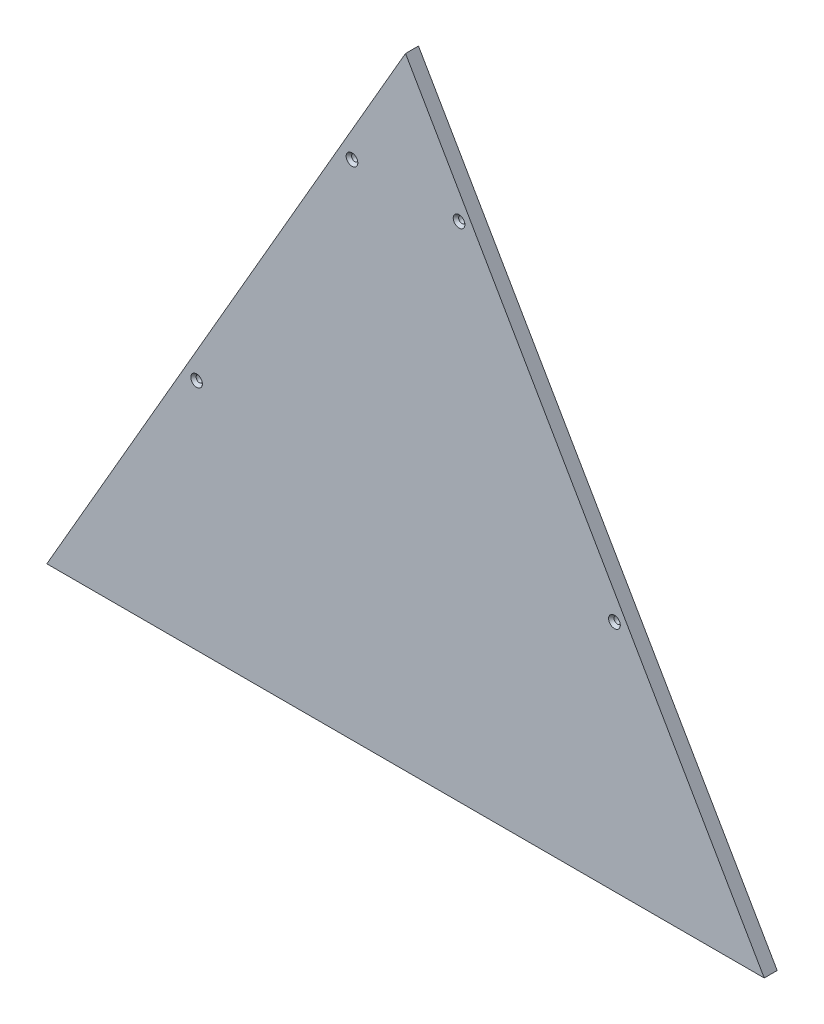
ISO-10303-21;
HEADER;
FILE_DESCRIPTION(('STEP AP214'),'2;1');
FILE_NAME('part.step','',(''),(''),'','','');
FILE_SCHEMA(('AUTOMOTIVE_DESIGN { 1 0 10303 214 1 1 1 1 }'));
ENDSEC;
DATA;
#1=APPLICATION_CONTEXT('core data for automotive mechanical design processes');
#2=APPLICATION_PROTOCOL_DEFINITION('international standard','automotive_design',2000,#1);
#3=PRODUCT_CONTEXT('',#1,'mechanical');
#4=PRODUCT('Part','Part','',(#3));
#5=PRODUCT_RELATED_PRODUCT_CATEGORY('part','',(#4));
#6=PRODUCT_DEFINITION_FORMATION('','',#4);
#7=PRODUCT_DEFINITION_CONTEXT('part definition',#1,'design');
#8=PRODUCT_DEFINITION('design','',#6,#7);
#9=PRODUCT_DEFINITION_SHAPE('','',#8);
#10=(LENGTH_UNIT() NAMED_UNIT(*) SI_UNIT(.MILLI.,.METRE.));
#11=(NAMED_UNIT(*) PLANE_ANGLE_UNIT() SI_UNIT($,.RADIAN.));
#12=(NAMED_UNIT(*) SI_UNIT($,.STERADIAN.) SOLID_ANGLE_UNIT());
#13=UNCERTAINTY_MEASURE_WITH_UNIT(LENGTH_MEASURE(1.E-05),#10,'distance_accuracy_value','');
#14=(GEOMETRIC_REPRESENTATION_CONTEXT(3) GLOBAL_UNCERTAINTY_ASSIGNED_CONTEXT((#13)) GLOBAL_UNIT_ASSIGNED_CONTEXT((#10,
#11,#12)) REPRESENTATION_CONTEXT('',''));
#15=CARTESIAN_POINT('',(0.,0.,0.));
#16=DIRECTION('',(0.,0.,1.));
#17=DIRECTION('',(1.,0.,0.));
#18=AXIS2_PLACEMENT_3D('',#15,#16,#17);
#19=CARTESIAN_POINT('',(248.805979943134,-140.260549088428,6.35));
#20=DIRECTION('',(-0.866025403784439,-0.5,0.));
#21=DIRECTION('',(0.5,-0.866025403784439,0.));
#22=AXIS2_PLACEMENT_3D('',#19,#20,#21);
#23=PLANE('',#22);
#24=DIRECTION('',(-0.5,0.866025403784439,0.));
#25=VECTOR('',#24,1.);
#26=CARTESIAN_POINT('',(248.805979943134,-140.260549088428,0.));
#27=LINE('',#26,#25);
#28=CARTESIAN_POINT('',(248.805979943134,-140.260549088428,0.));
#29=VERTEX_POINT('',#28);
#30=CARTESIAN_POINT('',(72.9109799431344,164.398527708899,0.));
#31=VERTEX_POINT('',#30);
#32=EDGE_CURVE('E94',#29,#31,#27,.T.);
#33=ORIENTED_EDGE('',*,*,#32,.T.);
#34=DIRECTION('',(0.,0.,-1.));
#35=VECTOR('',#34,1.);
#36=CARTESIAN_POINT('',(72.9109799431344,164.398527708899,6.35));
#37=LINE('',#36,#35);
#38=CARTESIAN_POINT('',(72.9109799431344,164.398527708899,6.35));
#39=VERTEX_POINT('',#38);
#40=EDGE_CURVE('E11',#39,#31,#37,.T.);
#41=ORIENTED_EDGE('',*,*,#40,.F.);
#42=DIRECTION('',(-0.5,0.866025403784439,0.));
#43=VECTOR('',#42,1.);
#44=CARTESIAN_POINT('',(248.805979943134,-140.260549088428,6.35));
#45=LINE('',#44,#43);
#46=CARTESIAN_POINT('',(248.805979943134,-140.260549088428,6.35));
#47=VERTEX_POINT('',#46);
#48=EDGE_CURVE('E86',#47,#39,#45,.T.);
#49=ORIENTED_EDGE('',*,*,#48,.F.);
#50=DIRECTION('',(0.,0.,-1.));
#51=VECTOR('',#50,1.);
#52=CARTESIAN_POINT('',(248.805979943134,-140.260549088428,6.35));
#53=LINE('',#52,#51);
#54=EDGE_CURVE('E95',#47,#29,#53,.T.);
#55=ORIENTED_EDGE('',*,*,#54,.T.);
#56=EDGE_LOOP('',(#33,#41,#49,#55));
#57=FACE_BOUND('',#56,.T.);
#58=ADVANCED_FACE('F38',(#57),#23,.F.);
#59=CARTESIAN_POINT('',(72.9109799431344,164.398527708899,6.35));
#60=DIRECTION('',(0.866025403784439,-0.5,0.));
#61=DIRECTION('',(0.5,0.866025403784439,0.));
#62=AXIS2_PLACEMENT_3D('',#59,#60,#61);
#63=PLANE('',#62);
#64=DIRECTION('',(-0.5,-0.866025403784439,0.));
#65=VECTOR('',#64,1.);
#66=CARTESIAN_POINT('',(72.9109799431344,164.398527708899,0.));
#67=LINE('',#66,#65);
#68=CARTESIAN_POINT('',(-102.984020056866,-140.260549088428,0.));
#69=VERTEX_POINT('',#68);
#70=EDGE_CURVE('E72',#31,#69,#67,.T.);
#71=ORIENTED_EDGE('',*,*,#70,.T.);
#72=DIRECTION('',(0.,0.,-1.));
#73=VECTOR('',#72,1.);
#74=CARTESIAN_POINT('',(-102.984020056866,-140.260549088428,6.35));
#75=LINE('',#74,#73);
#76=CARTESIAN_POINT('',(-102.984020056866,-140.260549088428,6.35));
#77=VERTEX_POINT('',#76);
#78=EDGE_CURVE('E47',#77,#69,#75,.T.);
#79=ORIENTED_EDGE('',*,*,#78,.F.);
#80=DIRECTION('',(-0.5,-0.866025403784439,0.));
#81=VECTOR('',#80,1.);
#82=CARTESIAN_POINT('',(72.9109799431344,164.398527708899,6.35));
#83=LINE('',#82,#81);
#84=EDGE_CURVE('E81',#39,#77,#83,.T.);
#85=ORIENTED_EDGE('',*,*,#84,.F.);
#86=ORIENTED_EDGE('',*,*,#40,.T.);
#87=EDGE_LOOP('',(#71,#79,#85,#86));
#88=FACE_BOUND('',#87,.T.);
#89=ADVANCED_FACE('F82',(#88),#63,.F.);
#90=CARTESIAN_POINT('',(-102.984020056866,-140.260549088428,6.35));
#91=DIRECTION('',(0.,1.,0.));
#92=DIRECTION('',(0.,0.,1.));
#93=AXIS2_PLACEMENT_3D('',#90,#91,#92);
#94=PLANE('',#93);
#95=DIRECTION('',(1.,0.,0.));
#96=VECTOR('',#95,1.);
#97=CARTESIAN_POINT('',(-102.984020056866,-140.260549088428,0.));
#98=LINE('',#97,#96);
#99=EDGE_CURVE('E77',#69,#29,#98,.T.);
#100=ORIENTED_EDGE('',*,*,#99,.T.);
#101=ORIENTED_EDGE('',*,*,#54,.F.);
#102=DIRECTION('',(1.,0.,0.));
#103=VECTOR('',#102,1.);
#104=CARTESIAN_POINT('',(-102.984020056866,-140.260549088428,6.35));
#105=LINE('',#104,#103);
#106=EDGE_CURVE('E58',#77,#47,#105,.T.);
#107=ORIENTED_EDGE('',*,*,#106,.F.);
#108=ORIENTED_EDGE('',*,*,#78,.T.);
#109=EDGE_LOOP('',(#100,#101,#107,#108));
#110=FACE_BOUND('',#109,.T.);
#111=ADVANCED_FACE('F115',(#110),#94,.F.);
#112=CARTESIAN_POINT('',(0.,0.,6.35));
#113=DIRECTION('',(0.,0.,1.));
#114=DIRECTION('',(1.,0.,0.));
#115=AXIS2_PLACEMENT_3D('',#112,#113,#114);
#116=PLANE('',#115);
#117=CARTESIAN_POINT('',(46.6602412571656,106.230914568587,6.35));
#118=DIRECTION('',(0.,0.,1.));
#119=DIRECTION('',(1.,0.,0.));
#120=AXIS2_PLACEMENT_3D('',#117,#118,#119);
#121=CIRCLE('',#120,2.8575);
#122=CARTESIAN_POINT('',(49.5177412571656,106.230914568587,6.35));
#123=VERTEX_POINT('',#122);
#124=EDGE_CURVE('E241',#123,#123,#121,.T.);
#125=ORIENTED_EDGE('',*,*,#124,.F.);
#126=EDGE_LOOP('',(#125));
#127=FACE_BOUND('',#126,.T.);
#128=CARTESIAN_POINT('',(-29.5397587428344,-25.7513569681609,6.35));
#129=DIRECTION('',(0.,0.,1.));
#130=DIRECTION('',(1.,0.,0.));
#131=AXIS2_PLACEMENT_3D('',#128,#129,#130);
#132=CIRCLE('',#131,2.8575);
#133=CARTESIAN_POINT('',(-26.6822587428344,-25.7513569681609,6.35));
#134=VERTEX_POINT('',#133);
#135=EDGE_CURVE('E250',#134,#134,#132,.T.);
#136=ORIENTED_EDGE('',*,*,#135,.F.);
#137=EDGE_LOOP('',(#136));
#138=FACE_BOUND('',#137,.T.);
#139=CARTESIAN_POINT('',(99.1617186291032,106.230914568587,6.35));
#140=DIRECTION('',(0.,0.,1.));
#141=DIRECTION('',(1.,0.,0.));
#142=AXIS2_PLACEMENT_3D('',#139,#140,#141);
#143=CIRCLE('',#142,2.8575);
#144=CARTESIAN_POINT('',(102.019218629103,106.230914568587,6.35));
#145=VERTEX_POINT('',#144);
#146=EDGE_CURVE('E262',#145,#145,#143,.T.);
#147=ORIENTED_EDGE('',*,*,#146,.F.);
#148=EDGE_LOOP('',(#147));
#149=FACE_BOUND('',#148,.T.);
#150=CARTESIAN_POINT('',(175.361718629103,-25.751356968161,6.35));
#151=DIRECTION('',(0.,0.,1.));
#152=DIRECTION('',(1.,0.,0.));
#153=AXIS2_PLACEMENT_3D('',#150,#151,#152);
#154=CIRCLE('',#153,2.85750000000001);
#155=CARTESIAN_POINT('',(178.219218629103,-25.751356968161,6.35));
#156=VERTEX_POINT('',#155);
#157=EDGE_CURVE('E273',#156,#156,#154,.T.);
#158=ORIENTED_EDGE('',*,*,#157,.F.);
#159=EDGE_LOOP('',(#158));
#160=FACE_BOUND('',#159,.T.);
#161=ORIENTED_EDGE('',*,*,#48,.T.);
#162=ORIENTED_EDGE('',*,*,#84,.T.);
#163=ORIENTED_EDGE('',*,*,#106,.T.);
#164=EDGE_LOOP('',(#161,#162,#163));
#165=FACE_BOUND('',#164,.T.);
#166=ADVANCED_FACE('F89',(#127,#138,#149,#160,#165),#116,.T.);
#167=CARTESIAN_POINT('',(0.,0.,0.));
#168=DIRECTION('',(0.,0.,1.));
#169=DIRECTION('',(1.,0.,0.));
#170=AXIS2_PLACEMENT_3D('',#167,#168,#169);
#171=PLANE('',#170);
#172=CARTESIAN_POINT('',(46.6602412571656,106.230914568587,0.));
#173=DIRECTION('',(0.,0.,1.));
#174=DIRECTION('',(1.,0.,0.));
#175=AXIS2_PLACEMENT_3D('',#172,#173,#174);
#176=CIRCLE('',#175,1.63194999999999);
#177=CARTESIAN_POINT('',(48.2921912571655,106.230914568587,0.));
#178=VERTEX_POINT('',#177);
#179=EDGE_CURVE('E245',#178,#178,#176,.T.);
#180=ORIENTED_EDGE('',*,*,#179,.T.);
#181=EDGE_LOOP('',(#180));
#182=FACE_BOUND('',#181,.T.);
#183=CARTESIAN_POINT('',(-29.5397587428344,-25.7513569681609,0.));
#184=DIRECTION('',(0.,0.,1.));
#185=DIRECTION('',(1.,0.,0.));
#186=AXIS2_PLACEMENT_3D('',#183,#184,#185);
#187=CIRCLE('',#186,1.63194999999999);
#188=CARTESIAN_POINT('',(-27.9078087428344,-25.7513569681609,0.));
#189=VERTEX_POINT('',#188);
#190=EDGE_CURVE('E258',#189,#189,#187,.T.);
#191=ORIENTED_EDGE('',*,*,#190,.T.);
#192=EDGE_LOOP('',(#191));
#193=FACE_BOUND('',#192,.T.);
#194=CARTESIAN_POINT('',(99.1617186291032,106.230914568587,0.));
#195=DIRECTION('',(0.,0.,1.));
#196=DIRECTION('',(1.,0.,0.));
#197=AXIS2_PLACEMENT_3D('',#194,#195,#196);
#198=CIRCLE('',#197,1.63194999999999);
#199=CARTESIAN_POINT('',(100.793668629103,106.230914568587,0.));
#200=VERTEX_POINT('',#199);
#201=EDGE_CURVE('E269',#200,#200,#198,.T.);
#202=ORIENTED_EDGE('',*,*,#201,.T.);
#203=EDGE_LOOP('',(#202));
#204=FACE_BOUND('',#203,.T.);
#205=CARTESIAN_POINT('',(175.361718629103,-25.751356968161,0.));
#206=DIRECTION('',(0.,0.,1.));
#207=DIRECTION('',(1.,0.,0.));
#208=AXIS2_PLACEMENT_3D('',#205,#206,#207);
#209=CIRCLE('',#208,1.63194999999999);
#210=CARTESIAN_POINT('',(176.993668629103,-25.751356968161,0.));
#211=VERTEX_POINT('',#210);
#212=EDGE_CURVE('E98',#211,#211,#209,.T.);
#213=ORIENTED_EDGE('',*,*,#212,.T.);
#214=EDGE_LOOP('',(#213));
#215=FACE_BOUND('',#214,.T.);
#216=ORIENTED_EDGE('',*,*,#32,.F.);
#217=ORIENTED_EDGE('',*,*,#99,.F.);
#218=ORIENTED_EDGE('',*,*,#70,.F.);
#219=EDGE_LOOP('',(#216,#217,#218));
#220=FACE_BOUND('',#219,.T.);
#221=ADVANCED_FACE('F116',(#182,#193,#204,#215,#220),#171,.F.);
#222=CARTESIAN_POINT('',(175.361718629103,-25.751356968161,6.35));
#223=DIRECTION('',(0.,0.,1.));
#224=DIRECTION('',(1.,0.,0.));
#225=AXIS2_PLACEMENT_3D('',#222,#223,#224);
#226=CYLINDRICAL_SURFACE('',#225,1.63194999999999);
#227=ORIENTED_EDGE('',*,*,#212,.F.);
#228=EDGE_LOOP('',(#227));
#229=FACE_BOUND('',#228,.T.);
#230=CARTESIAN_POINT('',(175.361718629103,-25.751356968161,4.94016599853026));
#231=DIRECTION('',(0.,0.,1.));
#232=DIRECTION('',(1.,0.,0.));
#233=AXIS2_PLACEMENT_3D('',#230,#231,#232);
#234=CIRCLE('',#233,1.63194999999999);
#235=CARTESIAN_POINT('',(176.993668629103,-25.751356968161,4.94016599853026));
#236=VERTEX_POINT('',#235);
#237=EDGE_CURVE('E105',#236,#236,#234,.T.);
#238=ORIENTED_EDGE('',*,*,#237,.T.);
#239=EDGE_LOOP('',(#238));
#240=FACE_BOUND('',#239,.T.);
#241=ADVANCED_FACE('F118',(#229,#240),#226,.F.);
#242=CARTESIAN_POINT('',(175.361718629103,-25.751356968161,6.35));
#243=DIRECTION('',(0.,0.,1.));
#244=DIRECTION('',(1.,0.,0.));
#245=AXIS2_PLACEMENT_3D('',#242,#243,#244);
#246=CONICAL_SURFACE('',#245,2.85750000000001,0.715584993317671);
#247=ORIENTED_EDGE('',*,*,#237,.F.);
#248=EDGE_LOOP('',(#247));
#249=FACE_BOUND('',#248,.T.);
#250=ORIENTED_EDGE('',*,*,#157,.T.);
#251=EDGE_LOOP('',(#250));
#252=FACE_BOUND('',#251,.T.);
#253=ADVANCED_FACE('F125',(#249,#252),#246,.F.);
#254=CARTESIAN_POINT('',(99.1617186291032,106.230914568587,6.35));
#255=DIRECTION('',(0.,0.,1.));
#256=DIRECTION('',(1.,0.,0.));
#257=AXIS2_PLACEMENT_3D('',#254,#255,#256);
#258=CYLINDRICAL_SURFACE('',#257,1.63194999999999);
#259=ORIENTED_EDGE('',*,*,#201,.F.);
#260=EDGE_LOOP('',(#259));
#261=FACE_BOUND('',#260,.T.);
#262=CARTESIAN_POINT('',(99.1617186291032,106.230914568587,4.94016599853026));
#263=DIRECTION('',(0.,0.,1.));
#264=DIRECTION('',(1.,0.,0.));
#265=AXIS2_PLACEMENT_3D('',#262,#263,#264);
#266=CIRCLE('',#265,1.63194999999999);
#267=CARTESIAN_POINT('',(100.793668629103,106.230914568587,4.94016599853026));
#268=VERTEX_POINT('',#267);
#269=EDGE_CURVE('E266',#268,#268,#266,.T.);
#270=ORIENTED_EDGE('',*,*,#269,.T.);
#271=EDGE_LOOP('',(#270));
#272=FACE_BOUND('',#271,.T.);
#273=ADVANCED_FACE('F171',(#261,#272),#258,.F.);
#274=CARTESIAN_POINT('',(99.1617186291032,106.230914568587,6.35));
#275=DIRECTION('',(0.,0.,1.));
#276=DIRECTION('',(1.,0.,0.));
#277=AXIS2_PLACEMENT_3D('',#274,#275,#276);
#278=CONICAL_SURFACE('',#277,2.8575,0.715584993317666);
#279=ORIENTED_EDGE('',*,*,#269,.F.);
#280=EDGE_LOOP('',(#279));
#281=FACE_BOUND('',#280,.T.);
#282=ORIENTED_EDGE('',*,*,#146,.T.);
#283=EDGE_LOOP('',(#282));
#284=FACE_BOUND('',#283,.T.);
#285=ADVANCED_FACE('F181',(#281,#284),#278,.F.);
#286=CARTESIAN_POINT('',(-29.5397587428344,-25.7513569681609,6.35));
#287=DIRECTION('',(0.,0.,1.));
#288=DIRECTION('',(1.,0.,0.));
#289=AXIS2_PLACEMENT_3D('',#286,#287,#288);
#290=CYLINDRICAL_SURFACE('',#289,1.63194999999999);
#291=ORIENTED_EDGE('',*,*,#190,.F.);
#292=EDGE_LOOP('',(#291));
#293=FACE_BOUND('',#292,.T.);
#294=CARTESIAN_POINT('',(-29.5397587428344,-25.7513569681609,4.94016599853026));
#295=DIRECTION('',(0.,0.,1.));
#296=DIRECTION('',(1.,0.,0.));
#297=AXIS2_PLACEMENT_3D('',#294,#295,#296);
#298=CIRCLE('',#297,1.63194999999999);
#299=CARTESIAN_POINT('',(-27.9078087428344,-25.7513569681609,4.94016599853026));
#300=VERTEX_POINT('',#299);
#301=EDGE_CURVE('E254',#300,#300,#298,.T.);
#302=ORIENTED_EDGE('',*,*,#301,.T.);
#303=EDGE_LOOP('',(#302));
#304=FACE_BOUND('',#303,.T.);
#305=ADVANCED_FACE('F191',(#293,#304),#290,.F.);
#306=CARTESIAN_POINT('',(-29.5397587428344,-25.7513569681609,6.35));
#307=DIRECTION('',(0.,0.,1.));
#308=DIRECTION('',(1.,0.,0.));
#309=AXIS2_PLACEMENT_3D('',#306,#307,#308);
#310=CONICAL_SURFACE('',#309,2.8575,0.715584993317669);
#311=ORIENTED_EDGE('',*,*,#301,.F.);
#312=EDGE_LOOP('',(#311));
#313=FACE_BOUND('',#312,.T.);
#314=ORIENTED_EDGE('',*,*,#135,.T.);
#315=EDGE_LOOP('',(#314));
#316=FACE_BOUND('',#315,.T.);
#317=ADVANCED_FACE('F201',(#313,#316),#310,.F.);
#318=CARTESIAN_POINT('',(46.6602412571656,106.230914568587,6.35));
#319=DIRECTION('',(0.,0.,1.));
#320=DIRECTION('',(1.,0.,0.));
#321=AXIS2_PLACEMENT_3D('',#318,#319,#320);
#322=CYLINDRICAL_SURFACE('',#321,1.63194999999999);
#323=ORIENTED_EDGE('',*,*,#179,.F.);
#324=EDGE_LOOP('',(#323));
#325=FACE_BOUND('',#324,.T.);
#326=CARTESIAN_POINT('',(46.6602412571656,106.230914568587,4.94016599853026));
#327=DIRECTION('',(0.,0.,1.));
#328=DIRECTION('',(1.,0.,0.));
#329=AXIS2_PLACEMENT_3D('',#326,#327,#328);
#330=CIRCLE('',#329,1.63194999999999);
#331=CARTESIAN_POINT('',(48.2921912571655,106.230914568587,4.94016599853026));
#332=VERTEX_POINT('',#331);
#333=EDGE_CURVE('E238',#332,#332,#330,.T.);
#334=ORIENTED_EDGE('',*,*,#333,.T.);
#335=EDGE_LOOP('',(#334));
#336=FACE_BOUND('',#335,.T.);
#337=ADVANCED_FACE('F211',(#325,#336),#322,.F.);
#338=CARTESIAN_POINT('',(46.6602412571656,106.230914568587,6.35));
#339=DIRECTION('',(0.,0.,1.));
#340=DIRECTION('',(1.,0.,0.));
#341=AXIS2_PLACEMENT_3D('',#338,#339,#340);
#342=CONICAL_SURFACE('',#341,2.8575,0.715584993317669);
#343=ORIENTED_EDGE('',*,*,#333,.F.);
#344=EDGE_LOOP('',(#343));
#345=FACE_BOUND('',#344,.T.);
#346=ORIENTED_EDGE('',*,*,#124,.T.);
#347=EDGE_LOOP('',(#346));
#348=FACE_BOUND('',#347,.T.);
#349=ADVANCED_FACE('F221',(#345,#348),#342,.F.);
#350=CLOSED_SHELL('',(#58,#89,#111,#166,#221,#241,#253,#273,#285,#305,#317,#337,#349));
#351=MANIFOLD_SOLID_BREP('B2',#350);
#352=ADVANCED_BREP_SHAPE_REPRESENTATION('',(#18,#351),#14);
#353=SHAPE_DEFINITION_REPRESENTATION(#9,#352);
ENDSEC;
END-ISO-10303-21;
